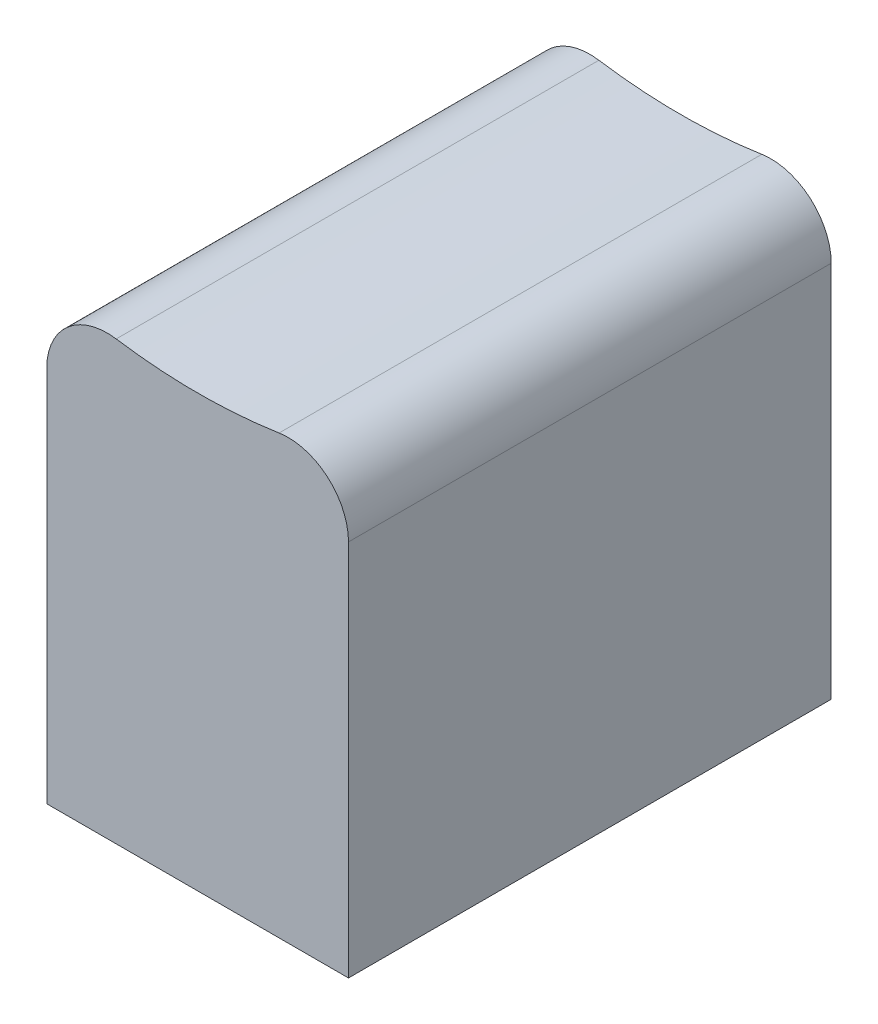
ISO-10303-21;
HEADER;
FILE_DESCRIPTION(('STEP AP214'),'2;1');
FILE_NAME('part.step','',(''),(''),'','','');
FILE_SCHEMA(('AUTOMOTIVE_DESIGN { 1 0 10303 214 1 1 1 1 }'));
ENDSEC;
DATA;
#1=APPLICATION_CONTEXT('core data for automotive mechanical design processes');
#2=APPLICATION_PROTOCOL_DEFINITION('international standard','automotive_design',2000,#1);
#3=PRODUCT_CONTEXT('',#1,'mechanical');
#4=PRODUCT('Part','Part','',(#3));
#5=PRODUCT_RELATED_PRODUCT_CATEGORY('part','',(#4));
#6=PRODUCT_DEFINITION_FORMATION('','',#4);
#7=PRODUCT_DEFINITION_CONTEXT('part definition',#1,'design');
#8=PRODUCT_DEFINITION('design','',#6,#7);
#9=PRODUCT_DEFINITION_SHAPE('','',#8);
#10=(LENGTH_UNIT() NAMED_UNIT(*) SI_UNIT(.MILLI.,.METRE.));
#11=(NAMED_UNIT(*) PLANE_ANGLE_UNIT() SI_UNIT($,.RADIAN.));
#12=(NAMED_UNIT(*) SI_UNIT($,.STERADIAN.) SOLID_ANGLE_UNIT());
#13=UNCERTAINTY_MEASURE_WITH_UNIT(LENGTH_MEASURE(1.E-05),#10,'distance_accuracy_value','');
#14=(GEOMETRIC_REPRESENTATION_CONTEXT(3) GLOBAL_UNCERTAINTY_ASSIGNED_CONTEXT((#13)) GLOBAL_UNIT_ASSIGNED_CONTEXT((#10,
#11,#12)) REPRESENTATION_CONTEXT('',''));
#15=CARTESIAN_POINT('',(0.,0.,0.));
#16=DIRECTION('',(0.,0.,1.));
#17=DIRECTION('',(1.,0.,0.));
#18=AXIS2_PLACEMENT_3D('',#15,#16,#17);
#19=CARTESIAN_POINT('',(0.,0.,0.));
#20=DIRECTION('',(0.,-1.,0.));
#21=DIRECTION('',(0.,0.,-1.));
#22=AXIS2_PLACEMENT_3D('',#19,#20,#21);
#23=PLANE('',#22);
#24=DIRECTION('',(0.,0.,1.));
#25=VECTOR('',#24,1.);
#26=CARTESIAN_POINT('',(-5.,0.,-8.));
#27=LINE('',#26,#25);
#28=CARTESIAN_POINT('',(-5.,0.,-8.));
#29=VERTEX_POINT('',#28);
#30=CARTESIAN_POINT('',(-5.,0.,8.));
#31=VERTEX_POINT('',#30);
#32=EDGE_CURVE('E141',#29,#31,#27,.T.);
#33=ORIENTED_EDGE('',*,*,#32,.F.);
#34=DIRECTION('',(-1.,0.,0.));
#35=VECTOR('',#34,1.);
#36=CARTESIAN_POINT('',(5.,0.,-8.));
#37=LINE('',#36,#35);
#38=CARTESIAN_POINT('',(5.,0.,-8.));
#39=VERTEX_POINT('',#38);
#40=EDGE_CURVE('E151',#39,#29,#37,.T.);
#41=ORIENTED_EDGE('',*,*,#40,.F.);
#42=DIRECTION('',(0.,0.,-1.));
#43=VECTOR('',#42,1.);
#44=CARTESIAN_POINT('',(5.,0.,-8.));
#45=LINE('',#44,#43);
#46=CARTESIAN_POINT('',(5.,0.,8.));
#47=VERTEX_POINT('',#46);
#48=EDGE_CURVE('E148',#47,#39,#45,.T.);
#49=ORIENTED_EDGE('',*,*,#48,.F.);
#50=DIRECTION('',(1.,0.,0.));
#51=VECTOR('',#50,1.);
#52=CARTESIAN_POINT('',(5.,0.,8.));
#53=LINE('',#52,#51);
#54=EDGE_CURVE('E145',#31,#47,#53,.T.);
#55=ORIENTED_EDGE('',*,*,#54,.F.);
#56=EDGE_LOOP('',(#33,#41,#49,#55));
#57=FACE_BOUND('',#56,.T.);
#58=DIRECTION('',(-1.,0.,0.));
#59=VECTOR('',#58,1.);
#60=CARTESIAN_POINT('',(2.,0.,-0.8));
#61=LINE('',#60,#59);
#62=CARTESIAN_POINT('',(2.,0.,-0.8));
#63=VERTEX_POINT('',#62);
#64=CARTESIAN_POINT('',(-2.,0.,-0.8));
#65=VERTEX_POINT('',#64);
#66=EDGE_CURVE('E126',#63,#65,#61,.T.);
#67=ORIENTED_EDGE('',*,*,#66,.T.);
#68=DIRECTION('',(0.,0.,1.));
#69=VECTOR('',#68,1.);
#70=CARTESIAN_POINT('',(-2.,0.,-0.8));
#71=LINE('',#70,#69);
#72=CARTESIAN_POINT('',(-2.,0.,0.8));
#73=VERTEX_POINT('',#72);
#74=EDGE_CURVE('E50',#65,#73,#71,.T.);
#75=ORIENTED_EDGE('',*,*,#74,.T.);
#76=DIRECTION('',(1.,0.,0.));
#77=VECTOR('',#76,1.);
#78=CARTESIAN_POINT('',(2.,0.,0.8));
#79=LINE('',#78,#77);
#80=CARTESIAN_POINT('',(2.,0.,0.8));
#81=VERTEX_POINT('',#80);
#82=EDGE_CURVE('E130',#73,#81,#79,.T.);
#83=ORIENTED_EDGE('',*,*,#82,.T.);
#84=DIRECTION('',(0.,0.,-1.));
#85=VECTOR('',#84,1.);
#86=CARTESIAN_POINT('',(2.,0.,-0.8));
#87=LINE('',#86,#85);
#88=EDGE_CURVE('E303',#81,#63,#87,.T.);
#89=ORIENTED_EDGE('',*,*,#88,.T.);
#90=EDGE_LOOP('',(#67,#75,#83,#89));
#91=FACE_BOUND('',#90,.T.);
#92=ADVANCED_FACE('F35',(#57,#91),#23,.T.);
#93=CARTESIAN_POINT('',(-5.,15.,-8.));
#94=DIRECTION('',(1.,0.,0.));
#95=DIRECTION('',(0.,0.,-1.));
#96=AXIS2_PLACEMENT_3D('',#93,#94,#95);
#97=PLANE('',#96);
#98=DIRECTION('',(0.,-1.,0.));
#99=VECTOR('',#98,1.);
#100=CARTESIAN_POINT('',(-5.,15.,8.));
#101=LINE('',#100,#99);
#102=CARTESIAN_POINT('',(-5.,12.5178965325054,8.));
#103=VERTEX_POINT('',#102);
#104=EDGE_CURVE('E160',#103,#31,#101,.T.);
#105=ORIENTED_EDGE('',*,*,#104,.F.);
#106=DIRECTION('',(0.,0.,-1.));
#107=VECTOR('',#106,1.);
#108=CARTESIAN_POINT('',(-5.,12.5178965325054,-8.));
#109=LINE('',#108,#107);
#110=CARTESIAN_POINT('',(-5.,12.5178965325054,-8.));
#111=VERTEX_POINT('',#110);
#112=EDGE_CURVE('E11',#103,#111,#109,.T.);
#113=ORIENTED_EDGE('',*,*,#112,.T.);
#114=DIRECTION('',(0.,-1.,0.));
#115=VECTOR('',#114,1.);
#116=CARTESIAN_POINT('',(-5.,15.,-8.));
#117=LINE('',#116,#115);
#118=EDGE_CURVE('E154',#111,#29,#117,.T.);
#119=ORIENTED_EDGE('',*,*,#118,.T.);
#120=ORIENTED_EDGE('',*,*,#32,.T.);
#121=EDGE_LOOP('',(#105,#113,#119,#120));
#122=FACE_BOUND('',#121,.T.);
#123=ADVANCED_FACE('F202',(#122),#97,.F.);
#124=CARTESIAN_POINT('',(5.,15.,8.));
#125=DIRECTION('',(0.,0.,-1.));
#126=DIRECTION('',(-1.,0.,0.));
#127=AXIS2_PLACEMENT_3D('',#124,#125,#126);
#128=PLANE('',#127);
#129=DIRECTION('',(0.,-1.,0.));
#130=VECTOR('',#129,1.);
#131=CARTESIAN_POINT('',(5.,15.,8.));
#132=LINE('',#131,#130);
#133=CARTESIAN_POINT('',(5.,12.5178965325054,8.));
#134=VERTEX_POINT('',#133);
#135=EDGE_CURVE('E158',#134,#47,#132,.T.);
#136=ORIENTED_EDGE('',*,*,#135,.F.);
#137=CARTESIAN_POINT('',(3.,12.5178965325054,8.));
#138=DIRECTION('',(0.,0.,-1.));
#139=DIRECTION('',(-1.,0.,0.));
#140=AXIS2_PLACEMENT_3D('',#137,#138,#139);
#141=CIRCLE('',#140,2.);
#142=CARTESIAN_POINT('',(2.7,14.4952685258339,8.));
#143=VERTEX_POINT('',#142);
#144=EDGE_CURVE('E43',#134,#143,#141,.F.);
#145=ORIENTED_EDGE('',*,*,#144,.T.);
#146=CARTESIAN_POINT('',(0.,32.2916164657906,8.));
#147=DIRECTION('',(0.,0.,-1.));
#148=DIRECTION('',(-1.,0.,0.));
#149=AXIS2_PLACEMENT_3D('',#146,#147,#148);
#150=CIRCLE('',#149,18.);
#151=CARTESIAN_POINT('',(-2.7,14.4952685258339,8.));
#152=VERTEX_POINT('',#151);
#153=EDGE_CURVE('E135',#143,#152,#150,.T.);
#154=ORIENTED_EDGE('',*,*,#153,.T.);
#155=CARTESIAN_POINT('',(-3.,12.5178965325054,8.));
#156=DIRECTION('',(0.,0.,-1.));
#157=DIRECTION('',(-1.,0.,0.));
#158=AXIS2_PLACEMENT_3D('',#155,#156,#157);
#159=CIRCLE('',#158,2.);
#160=EDGE_CURVE('E58',#152,#103,#159,.F.);
#161=ORIENTED_EDGE('',*,*,#160,.T.);
#162=ORIENTED_EDGE('',*,*,#104,.T.);
#163=ORIENTED_EDGE('',*,*,#54,.T.);
#164=EDGE_LOOP('',(#136,#145,#154,#161,#162,#163));
#165=FACE_BOUND('',#164,.T.);
#166=ADVANCED_FACE('F177',(#165),#128,.F.);
#167=CARTESIAN_POINT('',(5.,15.,-8.));
#168=DIRECTION('',(-1.,0.,0.));
#169=DIRECTION('',(0.,0.,1.));
#170=AXIS2_PLACEMENT_3D('',#167,#168,#169);
#171=PLANE('',#170);
#172=DIRECTION('',(0.,-1.,0.));
#173=VECTOR('',#172,1.);
#174=CARTESIAN_POINT('',(5.,15.,-8.));
#175=LINE('',#174,#173);
#176=CARTESIAN_POINT('',(5.,12.5178965325054,-8.));
#177=VERTEX_POINT('',#176);
#178=EDGE_CURVE('E156',#177,#39,#175,.T.);
#179=ORIENTED_EDGE('',*,*,#178,.F.);
#180=DIRECTION('',(0.,0.,-1.));
#181=VECTOR('',#180,1.);
#182=CARTESIAN_POINT('',(5.,12.5178965325054,-8.));
#183=LINE('',#182,#181);
#184=EDGE_CURVE('E172',#177,#134,#183,.F.);
#185=ORIENTED_EDGE('',*,*,#184,.T.);
#186=ORIENTED_EDGE('',*,*,#135,.T.);
#187=ORIENTED_EDGE('',*,*,#48,.T.);
#188=EDGE_LOOP('',(#179,#185,#186,#187));
#189=FACE_BOUND('',#188,.T.);
#190=ADVANCED_FACE('F190',(#189),#171,.F.);
#191=CARTESIAN_POINT('',(5.,15.,-8.));
#192=DIRECTION('',(0.,0.,1.));
#193=DIRECTION('',(1.,0.,0.));
#194=AXIS2_PLACEMENT_3D('',#191,#192,#193);
#195=PLANE('',#194);
#196=CARTESIAN_POINT('',(0.,32.2916164657906,-8.));
#197=DIRECTION('',(0.,0.,-1.));
#198=DIRECTION('',(-1.,0.,0.));
#199=AXIS2_PLACEMENT_3D('',#196,#197,#198);
#200=CIRCLE('',#199,18.);
#201=CARTESIAN_POINT('',(2.7,14.4952685258339,-8.));
#202=VERTEX_POINT('',#201);
#203=CARTESIAN_POINT('',(-2.7,14.4952685258339,-8.));
#204=VERTEX_POINT('',#203);
#205=EDGE_CURVE('E131',#202,#204,#200,.T.);
#206=ORIENTED_EDGE('',*,*,#205,.F.);
#207=CARTESIAN_POINT('',(3.,12.5178965325054,-8.));
#208=DIRECTION('',(0.,0.,1.));
#209=DIRECTION('',(1.,0.,0.));
#210=AXIS2_PLACEMENT_3D('',#207,#208,#209);
#211=CIRCLE('',#210,2.);
#212=EDGE_CURVE('E170',#202,#177,#211,.F.);
#213=ORIENTED_EDGE('',*,*,#212,.T.);
#214=ORIENTED_EDGE('',*,*,#178,.T.);
#215=ORIENTED_EDGE('',*,*,#40,.T.);
#216=ORIENTED_EDGE('',*,*,#118,.F.);
#217=CARTESIAN_POINT('',(-3.,12.5178965325054,-8.));
#218=DIRECTION('',(0.,0.,1.));
#219=DIRECTION('',(1.,0.,0.));
#220=AXIS2_PLACEMENT_3D('',#217,#218,#219);
#221=CIRCLE('',#220,2.);
#222=EDGE_CURVE('E168',#111,#204,#221,.F.);
#223=ORIENTED_EDGE('',*,*,#222,.T.);
#224=EDGE_LOOP('',(#206,#213,#214,#215,#216,#223));
#225=FACE_BOUND('',#224,.T.);
#226=ADVANCED_FACE('F188',(#225),#195,.F.);
#227=CARTESIAN_POINT('',(0.,32.2916164657906,8.));
#228=DIRECTION('',(0.,0.,-1.));
#229=DIRECTION('',(-1.,0.,0.));
#230=AXIS2_PLACEMENT_3D('',#227,#228,#229);
#231=CYLINDRICAL_SURFACE('',#230,18.);
#232=ORIENTED_EDGE('',*,*,#153,.F.);
#233=DIRECTION('',(0.,0.,-1.));
#234=VECTOR('',#233,1.);
#235=CARTESIAN_POINT('',(2.7,14.4952685258339,8.));
#236=LINE('',#235,#234);
#237=EDGE_CURVE('E165',#143,#202,#236,.T.);
#238=ORIENTED_EDGE('',*,*,#237,.T.);
#239=ORIENTED_EDGE('',*,*,#205,.T.);
#240=DIRECTION('',(0.,0.,-1.));
#241=VECTOR('',#240,1.);
#242=CARTESIAN_POINT('',(-2.7,14.4952685258339,8.));
#243=LINE('',#242,#241);
#244=EDGE_CURVE('E162',#204,#152,#243,.F.);
#245=ORIENTED_EDGE('',*,*,#244,.T.);
#246=EDGE_LOOP('',(#232,#238,#239,#245));
#247=FACE_BOUND('',#246,.T.);
#248=ADVANCED_FACE('F182',(#247),#231,.F.);
#249=CARTESIAN_POINT('',(3.,12.5178965325054,8.));
#250=DIRECTION('',(0.,0.,-1.));
#251=DIRECTION('',(-1.,0.,0.));
#252=AXIS2_PLACEMENT_3D('',#249,#250,#251);
#253=CYLINDRICAL_SURFACE('',#252,2.);
#254=ORIENTED_EDGE('',*,*,#144,.F.);
#255=ORIENTED_EDGE('',*,*,#184,.F.);
#256=ORIENTED_EDGE('',*,*,#212,.F.);
#257=ORIENTED_EDGE('',*,*,#237,.F.);
#258=EDGE_LOOP('',(#254,#255,#256,#257));
#259=FACE_BOUND('',#258,.T.);
#260=ADVANCED_FACE('F185',(#259),#253,.T.);
#261=CARTESIAN_POINT('',(-3.,12.5178965325054,8.));
#262=DIRECTION('',(0.,0.,-1.));
#263=DIRECTION('',(-1.,0.,0.));
#264=AXIS2_PLACEMENT_3D('',#261,#262,#263);
#265=CYLINDRICAL_SURFACE('',#264,2.);
#266=ORIENTED_EDGE('',*,*,#222,.F.);
#267=ORIENTED_EDGE('',*,*,#112,.F.);
#268=ORIENTED_EDGE('',*,*,#160,.F.);
#269=ORIENTED_EDGE('',*,*,#244,.F.);
#270=EDGE_LOOP('',(#266,#267,#268,#269));
#271=FACE_BOUND('',#270,.T.);
#272=ADVANCED_FACE('F37',(#271),#265,.T.);
#273=CARTESIAN_POINT('',(-2.,12.,-0.8));
#274=DIRECTION('',(1.,0.,0.));
#275=DIRECTION('',(0.,0.,-1.));
#276=AXIS2_PLACEMENT_3D('',#273,#274,#275);
#277=PLANE('',#276);
#278=ORIENTED_EDGE('',*,*,#74,.F.);
#279=DIRECTION('',(0.,-1.,0.));
#280=VECTOR('',#279,1.);
#281=CARTESIAN_POINT('',(-2.,12.,-0.8));
#282=LINE('',#281,#280);
#283=CARTESIAN_POINT('',(-2.,12.,-0.8));
#284=VERTEX_POINT('',#283);
#285=EDGE_CURVE('E125',#284,#65,#282,.T.);
#286=ORIENTED_EDGE('',*,*,#285,.F.);
#287=DIRECTION('',(0.,0.,1.));
#288=VECTOR('',#287,1.);
#289=CARTESIAN_POINT('',(-2.,12.,-0.8));
#290=LINE('',#289,#288);
#291=CARTESIAN_POINT('',(-2.,12.,0.8));
#292=VERTEX_POINT('',#291);
#293=EDGE_CURVE('E117',#284,#292,#290,.T.);
#294=ORIENTED_EDGE('',*,*,#293,.T.);
#295=DIRECTION('',(0.,-1.,0.));
#296=VECTOR('',#295,1.);
#297=CARTESIAN_POINT('',(-2.,12.,0.8));
#298=LINE('',#297,#296);
#299=EDGE_CURVE('E124',#292,#73,#298,.T.);
#300=ORIENTED_EDGE('',*,*,#299,.T.);
#301=EDGE_LOOP('',(#278,#286,#294,#300));
#302=FACE_BOUND('',#301,.T.);
#303=ADVANCED_FACE('F123',(#302),#277,.T.);
#304=CARTESIAN_POINT('',(2.,12.,0.8));
#305=DIRECTION('',(0.,0.,-1.));
#306=DIRECTION('',(-1.,0.,0.));
#307=AXIS2_PLACEMENT_3D('',#304,#305,#306);
#308=PLANE('',#307);
#309=ORIENTED_EDGE('',*,*,#82,.F.);
#310=ORIENTED_EDGE('',*,*,#299,.F.);
#311=DIRECTION('',(1.,0.,0.));
#312=VECTOR('',#311,1.);
#313=CARTESIAN_POINT('',(2.,12.,0.8));
#314=LINE('',#313,#312);
#315=CARTESIAN_POINT('',(2.,12.,0.8));
#316=VERTEX_POINT('',#315);
#317=EDGE_CURVE('E113',#292,#316,#314,.T.);
#318=ORIENTED_EDGE('',*,*,#317,.T.);
#319=DIRECTION('',(0.,-1.,0.));
#320=VECTOR('',#319,1.);
#321=CARTESIAN_POINT('',(2.,12.,0.8));
#322=LINE('',#321,#320);
#323=EDGE_CURVE('E132',#316,#81,#322,.T.);
#324=ORIENTED_EDGE('',*,*,#323,.T.);
#325=EDGE_LOOP('',(#309,#310,#318,#324));
#326=FACE_BOUND('',#325,.T.);
#327=ADVANCED_FACE('F128',(#326),#308,.T.);
#328=CARTESIAN_POINT('',(2.,12.,-0.8));
#329=DIRECTION('',(-1.,0.,0.));
#330=DIRECTION('',(0.,0.,1.));
#331=AXIS2_PLACEMENT_3D('',#328,#329,#330);
#332=PLANE('',#331);
#333=ORIENTED_EDGE('',*,*,#88,.F.);
#334=ORIENTED_EDGE('',*,*,#323,.F.);
#335=DIRECTION('',(0.,0.,-1.));
#336=VECTOR('',#335,1.);
#337=CARTESIAN_POINT('',(2.,12.,-0.8));
#338=LINE('',#337,#336);
#339=CARTESIAN_POINT('',(2.,12.,-0.8));
#340=VERTEX_POINT('',#339);
#341=EDGE_CURVE('E118',#316,#340,#338,.T.);
#342=ORIENTED_EDGE('',*,*,#341,.T.);
#343=DIRECTION('',(0.,-1.,0.));
#344=VECTOR('',#343,1.);
#345=CARTESIAN_POINT('',(2.,12.,-0.8));
#346=LINE('',#345,#344);
#347=EDGE_CURVE('E137',#340,#63,#346,.T.);
#348=ORIENTED_EDGE('',*,*,#347,.T.);
#349=EDGE_LOOP('',(#333,#334,#342,#348));
#350=FACE_BOUND('',#349,.T.);
#351=ADVANCED_FACE('F269',(#350),#332,.T.);
#352=CARTESIAN_POINT('',(2.,12.,-0.8));
#353=DIRECTION('',(0.,0.,1.));
#354=DIRECTION('',(1.,0.,0.));
#355=AXIS2_PLACEMENT_3D('',#352,#353,#354);
#356=PLANE('',#355);
#357=ORIENTED_EDGE('',*,*,#66,.F.);
#358=ORIENTED_EDGE('',*,*,#347,.F.);
#359=DIRECTION('',(-1.,0.,0.));
#360=VECTOR('',#359,1.);
#361=CARTESIAN_POINT('',(2.,12.,-0.8));
#362=LINE('',#361,#360);
#363=EDGE_CURVE('E310',#340,#284,#362,.T.);
#364=ORIENTED_EDGE('',*,*,#363,.T.);
#365=ORIENTED_EDGE('',*,*,#285,.T.);
#366=EDGE_LOOP('',(#357,#358,#364,#365));
#367=FACE_BOUND('',#366,.T.);
#368=ADVANCED_FACE('F277',(#367),#356,.T.);
#369=CARTESIAN_POINT('',(0.,12.,0.));
#370=DIRECTION('',(0.,-1.,0.));
#371=DIRECTION('',(0.,0.,-1.));
#372=AXIS2_PLACEMENT_3D('',#369,#370,#371);
#373=PLANE('',#372);
#374=ORIENTED_EDGE('',*,*,#293,.F.);
#375=ORIENTED_EDGE('',*,*,#363,.F.);
#376=ORIENTED_EDGE('',*,*,#341,.F.);
#377=ORIENTED_EDGE('',*,*,#317,.F.);
#378=EDGE_LOOP('',(#374,#375,#376,#377));
#379=FACE_BOUND('',#378,.T.);
#380=ADVANCED_FACE('F115',(#379),#373,.T.);
#381=CLOSED_SHELL('',(#92,#123,#166,#190,#226,#248,#260,#272,#303,#327,#351,#368,#380));
#382=MANIFOLD_SOLID_BREP('B2',#381);
#383=ADVANCED_BREP_SHAPE_REPRESENTATION('',(#18,#382),#14);
#384=SHAPE_DEFINITION_REPRESENTATION(#9,#383);
ENDSEC;
END-ISO-10303-21;
